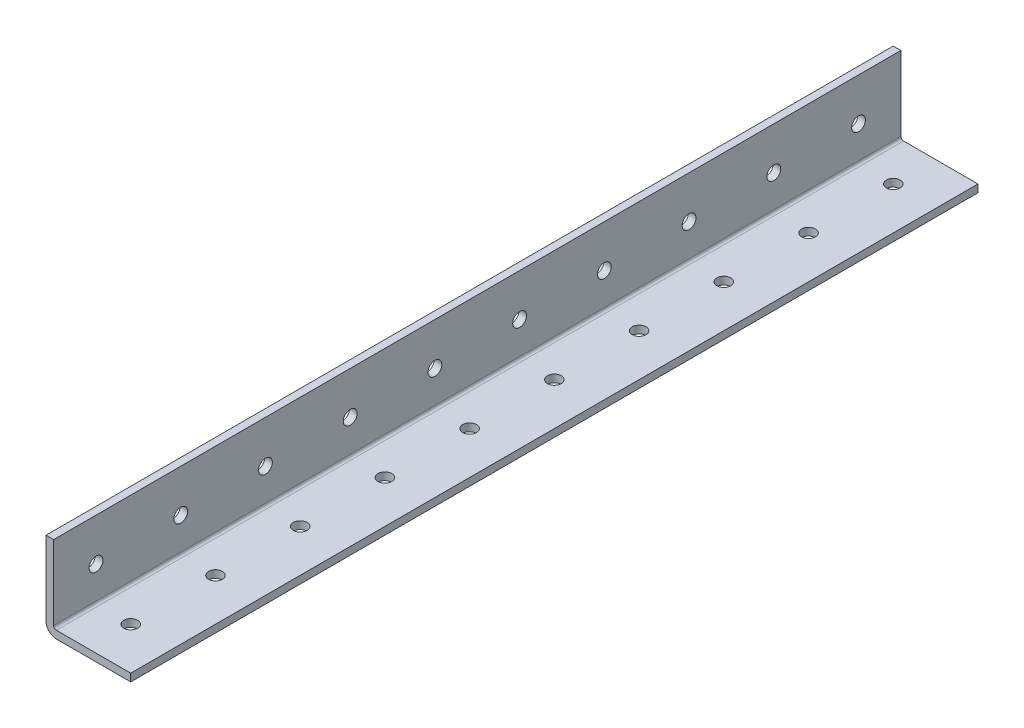
ISO-10303-21;
HEADER;
FILE_DESCRIPTION(('STEP AP214'),'2;1');
FILE_NAME('part.step','',(''),(''),'','','');
FILE_SCHEMA(('AUTOMOTIVE_DESIGN { 1 0 10303 214 1 1 1 1 }'));
ENDSEC;
DATA;
#1=APPLICATION_CONTEXT('core data for automotive mechanical design processes');
#2=APPLICATION_PROTOCOL_DEFINITION('international standard','automotive_design',2000,#1);
#3=PRODUCT_CONTEXT('',#1,'mechanical');
#4=PRODUCT('Part','Part','',(#3));
#5=PRODUCT_RELATED_PRODUCT_CATEGORY('part','',(#4));
#6=PRODUCT_DEFINITION_FORMATION('','',#4);
#7=PRODUCT_DEFINITION_CONTEXT('part definition',#1,'design');
#8=PRODUCT_DEFINITION('design','',#6,#7);
#9=PRODUCT_DEFINITION_SHAPE('','',#8);
#10=(LENGTH_UNIT() NAMED_UNIT(*) SI_UNIT(.MILLI.,.METRE.));
#11=(NAMED_UNIT(*) PLANE_ANGLE_UNIT() SI_UNIT($,.RADIAN.));
#12=(NAMED_UNIT(*) SI_UNIT($,.STERADIAN.) SOLID_ANGLE_UNIT());
#13=UNCERTAINTY_MEASURE_WITH_UNIT(LENGTH_MEASURE(1.E-05),#10,'distance_accuracy_value','');
#14=(GEOMETRIC_REPRESENTATION_CONTEXT(3) GLOBAL_UNCERTAINTY_ASSIGNED_CONTEXT((#13)) GLOBAL_UNIT_ASSIGNED_CONTEXT((#10,
#11,#12)) REPRESENTATION_CONTEXT('',''));
#15=CARTESIAN_POINT('',(0.,0.,0.));
#16=DIRECTION('',(0.,0.,1.));
#17=DIRECTION('',(1.,0.,0.));
#18=AXIS2_PLACEMENT_3D('',#15,#16,#17);
#19=CARTESIAN_POINT('',(3.0988,3.0988,-749.3));
#20=DIRECTION('',(0.,0.,1.));
#21=DIRECTION('',(1.,0.,0.));
#22=AXIS2_PLACEMENT_3D('',#19,#20,#21);
#23=CYLINDRICAL_SURFACE('',#22,0.8128);
#24=DIRECTION('',(0.,0.,-1.));
#25=VECTOR('',#24,1.);
#26=CARTESIAN_POINT('',(3.0988,2.286,-749.3));
#27=LINE('',#26,#25);
#28=CARTESIAN_POINT('',(3.0988,2.286,114.3));
#29=VERTEX_POINT('',#28);
#30=CARTESIAN_POINT('',(3.0988,2.286,-139.7));
#31=VERTEX_POINT('',#30);
#32=EDGE_CURVE('E93',#29,#31,#27,.T.);
#33=ORIENTED_EDGE('',*,*,#32,.T.);
#34=CARTESIAN_POINT('',(3.0988,3.0988,-139.7));
#35=DIRECTION('',(0.,0.,1.));
#36=DIRECTION('',(1.,0.,0.));
#37=AXIS2_PLACEMENT_3D('',#34,#35,#36);
#38=CIRCLE('',#37,0.8128);
#39=CARTESIAN_POINT('',(2.286,3.0988,-139.7));
#40=VERTEX_POINT('',#39);
#41=EDGE_CURVE('E20',#40,#31,#38,.T.);
#42=ORIENTED_EDGE('',*,*,#41,.F.);
#43=DIRECTION('',(0.,0.,1.));
#44=VECTOR('',#43,1.);
#45=CARTESIAN_POINT('',(2.286,3.0988,-749.3));
#46=LINE('',#45,#44);
#47=CARTESIAN_POINT('',(2.286,3.0988,114.3));
#48=VERTEX_POINT('',#47);
#49=EDGE_CURVE('E170',#40,#48,#46,.T.);
#50=ORIENTED_EDGE('',*,*,#49,.T.);
#51=CARTESIAN_POINT('',(3.0988,3.0988,114.3));
#52=DIRECTION('',(0.,0.,1.));
#53=DIRECTION('',(1.,0.,0.));
#54=AXIS2_PLACEMENT_3D('',#51,#52,#53);
#55=CIRCLE('',#54,0.8128);
#56=EDGE_CURVE('E91',#29,#48,#55,.F.);
#57=ORIENTED_EDGE('',*,*,#56,.F.);
#58=EDGE_LOOP('',(#33,#42,#50,#57));
#59=FACE_BOUND('',#58,.T.);
#60=ADVANCED_FACE('F17',(#59),#23,.F.);
#61=CARTESIAN_POINT('',(12.7,25.4000000000001,101.6));
#62=DIRECTION('',(0.,-1.,0.));
#63=DIRECTION('',(0.,0.,-1.));
#64=AXIS2_PLACEMENT_3D('',#61,#62,#63);
#65=CYLINDRICAL_SURFACE('',#64,2.07009999999999);
#66=CARTESIAN_POINT('',(12.7,2.286,101.6));
#67=DIRECTION('',(0.,-1.,0.));
#68=DIRECTION('',(0.,0.,-1.));
#69=AXIS2_PLACEMENT_3D('',#66,#67,#68);
#70=CIRCLE('',#69,2.07009999999999);
#71=CARTESIAN_POINT('',(12.7,2.286,99.5298999999999));
#72=VERTEX_POINT('',#71);
#73=EDGE_CURVE('E172',#72,#72,#70,.F.);
#74=ORIENTED_EDGE('',*,*,#73,.T.);
#75=EDGE_LOOP('',(#74));
#76=FACE_BOUND('',#75,.T.);
#77=CARTESIAN_POINT('',(12.7,0.,101.6));
#78=DIRECTION('',(0.,-1.,0.));
#79=DIRECTION('',(0.,0.,-1.));
#80=AXIS2_PLACEMENT_3D('',#77,#78,#79);
#81=CIRCLE('',#80,2.07009999999999);
#82=CARTESIAN_POINT('',(12.7,0.,99.5298999999999));
#83=VERTEX_POINT('',#82);
#84=EDGE_CURVE('E167',#83,#83,#81,.F.);
#85=ORIENTED_EDGE('',*,*,#84,.F.);
#86=EDGE_LOOP('',(#85));
#87=FACE_BOUND('',#86,.T.);
#88=ADVANCED_FACE('F427',(#76,#87),#65,.F.);
#89=CARTESIAN_POINT('',(12.7,25.4000000000001,76.1999999999999));
#90=DIRECTION('',(0.,-1.,0.));
#91=DIRECTION('',(0.,0.,-1.));
#92=AXIS2_PLACEMENT_3D('',#89,#90,#91);
#93=CYLINDRICAL_SURFACE('',#92,2.07009999999999);
#94=CARTESIAN_POINT('',(12.7,2.286,76.1999999999999));
#95=DIRECTION('',(0.,-1.,0.));
#96=DIRECTION('',(0.,0.,-1.));
#97=AXIS2_PLACEMENT_3D('',#94,#95,#96);
#98=CIRCLE('',#97,2.07009999999999);
#99=CARTESIAN_POINT('',(12.7,2.286,74.1298999999999));
#100=VERTEX_POINT('',#99);
#101=EDGE_CURVE('E292',#100,#100,#98,.F.);
#102=ORIENTED_EDGE('',*,*,#101,.T.);
#103=EDGE_LOOP('',(#102));
#104=FACE_BOUND('',#103,.T.);
#105=CARTESIAN_POINT('',(12.7,0.,76.1999999999999));
#106=DIRECTION('',(0.,-1.,0.));
#107=DIRECTION('',(0.,0.,-1.));
#108=AXIS2_PLACEMENT_3D('',#105,#106,#107);
#109=CIRCLE('',#108,2.07009999999999);
#110=CARTESIAN_POINT('',(12.7,0.,74.1298999999999));
#111=VERTEX_POINT('',#110);
#112=EDGE_CURVE('E264',#111,#111,#109,.F.);
#113=ORIENTED_EDGE('',*,*,#112,.F.);
#114=EDGE_LOOP('',(#113));
#115=FACE_BOUND('',#114,.T.);
#116=ADVANCED_FACE('F424',(#104,#115),#93,.F.);
#117=CARTESIAN_POINT('',(12.7,25.4000000000001,50.8));
#118=DIRECTION('',(0.,-1.,0.));
#119=DIRECTION('',(0.,0.,-1.));
#120=AXIS2_PLACEMENT_3D('',#117,#118,#119);
#121=CYLINDRICAL_SURFACE('',#120,2.07009999999999);
#122=CARTESIAN_POINT('',(12.7,2.286,50.8));
#123=DIRECTION('',(0.,-1.,0.));
#124=DIRECTION('',(0.,0.,-1.));
#125=AXIS2_PLACEMENT_3D('',#122,#123,#124);
#126=CIRCLE('',#125,2.07009999999999);
#127=CARTESIAN_POINT('',(12.7,2.286,48.7299));
#128=VERTEX_POINT('',#127);
#129=EDGE_CURVE('E289',#128,#128,#126,.F.);
#130=ORIENTED_EDGE('',*,*,#129,.T.);
#131=EDGE_LOOP('',(#130));
#132=FACE_BOUND('',#131,.T.);
#133=CARTESIAN_POINT('',(12.7,0.,50.8));
#134=DIRECTION('',(0.,-1.,0.));
#135=DIRECTION('',(0.,0.,-1.));
#136=AXIS2_PLACEMENT_3D('',#133,#134,#135);
#137=CIRCLE('',#136,2.07009999999999);
#138=CARTESIAN_POINT('',(12.7,0.,48.7299));
#139=VERTEX_POINT('',#138);
#140=EDGE_CURVE('E261',#139,#139,#137,.F.);
#141=ORIENTED_EDGE('',*,*,#140,.F.);
#142=EDGE_LOOP('',(#141));
#143=FACE_BOUND('',#142,.T.);
#144=ADVANCED_FACE('F420',(#132,#143),#121,.F.);
#145=CARTESIAN_POINT('',(12.7,25.4000000000001,25.4));
#146=DIRECTION('',(0.,-1.,0.));
#147=DIRECTION('',(0.,0.,-1.));
#148=AXIS2_PLACEMENT_3D('',#145,#146,#147);
#149=CYLINDRICAL_SURFACE('',#148,2.07009999999999);
#150=CARTESIAN_POINT('',(12.7,2.286,25.4));
#151=DIRECTION('',(0.,-1.,0.));
#152=DIRECTION('',(0.,0.,-1.));
#153=AXIS2_PLACEMENT_3D('',#150,#151,#152);
#154=CIRCLE('',#153,2.07009999999999);
#155=CARTESIAN_POINT('',(12.7,2.286,23.3299));
#156=VERTEX_POINT('',#155);
#157=EDGE_CURVE('E286',#156,#156,#154,.F.);
#158=ORIENTED_EDGE('',*,*,#157,.T.);
#159=EDGE_LOOP('',(#158));
#160=FACE_BOUND('',#159,.T.);
#161=CARTESIAN_POINT('',(12.7,0.,25.4));
#162=DIRECTION('',(0.,-1.,0.));
#163=DIRECTION('',(0.,0.,-1.));
#164=AXIS2_PLACEMENT_3D('',#161,#162,#163);
#165=CIRCLE('',#164,2.07009999999999);
#166=CARTESIAN_POINT('',(12.7,0.,23.3299));
#167=VERTEX_POINT('',#166);
#168=EDGE_CURVE('E258',#167,#167,#165,.F.);
#169=ORIENTED_EDGE('',*,*,#168,.F.);
#170=EDGE_LOOP('',(#169));
#171=FACE_BOUND('',#170,.T.);
#172=ADVANCED_FACE('F416',(#160,#171),#149,.F.);
#173=CARTESIAN_POINT('',(12.7,25.4000000000001,0.));
#174=DIRECTION('',(0.,-1.,0.));
#175=DIRECTION('',(0.,0.,-1.));
#176=AXIS2_PLACEMENT_3D('',#173,#174,#175);
#177=CYLINDRICAL_SURFACE('',#176,2.07009999999999);
#178=CARTESIAN_POINT('',(12.7,2.286,0.));
#179=DIRECTION('',(0.,-1.,0.));
#180=DIRECTION('',(0.,0.,-1.));
#181=AXIS2_PLACEMENT_3D('',#178,#179,#180);
#182=CIRCLE('',#181,2.07009999999999);
#183=CARTESIAN_POINT('',(12.7,2.286,-2.07009999999999));
#184=VERTEX_POINT('',#183);
#185=EDGE_CURVE('E283',#184,#184,#182,.F.);
#186=ORIENTED_EDGE('',*,*,#185,.T.);
#187=EDGE_LOOP('',(#186));
#188=FACE_BOUND('',#187,.T.);
#189=CARTESIAN_POINT('',(12.7,0.,0.));
#190=DIRECTION('',(0.,-1.,0.));
#191=DIRECTION('',(0.,0.,-1.));
#192=AXIS2_PLACEMENT_3D('',#189,#190,#191);
#193=CIRCLE('',#192,2.07009999999999);
#194=CARTESIAN_POINT('',(12.7,0.,-2.07009999999999));
#195=VERTEX_POINT('',#194);
#196=EDGE_CURVE('E255',#195,#195,#193,.F.);
#197=ORIENTED_EDGE('',*,*,#196,.F.);
#198=EDGE_LOOP('',(#197));
#199=FACE_BOUND('',#198,.T.);
#200=ADVANCED_FACE('F412',(#188,#199),#177,.F.);
#201=CARTESIAN_POINT('',(12.7,25.4000000000001,-25.4000000000001));
#202=DIRECTION('',(0.,-1.,0.));
#203=DIRECTION('',(0.,0.,-1.));
#204=AXIS2_PLACEMENT_3D('',#201,#202,#203);
#205=CYLINDRICAL_SURFACE('',#204,2.07009999999999);
#206=CARTESIAN_POINT('',(12.7,2.286,-25.4000000000001));
#207=DIRECTION('',(0.,-1.,0.));
#208=DIRECTION('',(0.,0.,-1.));
#209=AXIS2_PLACEMENT_3D('',#206,#207,#208);
#210=CIRCLE('',#209,2.07009999999999);
#211=CARTESIAN_POINT('',(12.7,2.286,-27.4701000000001));
#212=VERTEX_POINT('',#211);
#213=EDGE_CURVE('E280',#212,#212,#210,.F.);
#214=ORIENTED_EDGE('',*,*,#213,.T.);
#215=EDGE_LOOP('',(#214));
#216=FACE_BOUND('',#215,.T.);
#217=CARTESIAN_POINT('',(12.7,0.,-25.4000000000001));
#218=DIRECTION('',(0.,-1.,0.));
#219=DIRECTION('',(0.,0.,-1.));
#220=AXIS2_PLACEMENT_3D('',#217,#218,#219);
#221=CIRCLE('',#220,2.07009999999999);
#222=CARTESIAN_POINT('',(12.7,0.,-27.4701000000001));
#223=VERTEX_POINT('',#222);
#224=EDGE_CURVE('E252',#223,#223,#221,.F.);
#225=ORIENTED_EDGE('',*,*,#224,.F.);
#226=EDGE_LOOP('',(#225));
#227=FACE_BOUND('',#226,.T.);
#228=ADVANCED_FACE('F408',(#216,#227),#205,.F.);
#229=CARTESIAN_POINT('',(12.7,25.4000000000001,-50.8000000000001));
#230=DIRECTION('',(0.,-1.,0.));
#231=DIRECTION('',(0.,0.,-1.));
#232=AXIS2_PLACEMENT_3D('',#229,#230,#231);
#233=CYLINDRICAL_SURFACE('',#232,2.07009999999999);
#234=CARTESIAN_POINT('',(12.7,2.286,-50.8000000000001));
#235=DIRECTION('',(0.,-1.,0.));
#236=DIRECTION('',(0.,0.,-1.));
#237=AXIS2_PLACEMENT_3D('',#234,#235,#236);
#238=CIRCLE('',#237,2.07009999999999);
#239=CARTESIAN_POINT('',(12.7,2.286,-52.8701000000001));
#240=VERTEX_POINT('',#239);
#241=EDGE_CURVE('E277',#240,#240,#238,.F.);
#242=ORIENTED_EDGE('',*,*,#241,.T.);
#243=EDGE_LOOP('',(#242));
#244=FACE_BOUND('',#243,.T.);
#245=CARTESIAN_POINT('',(12.7,0.,-50.8000000000001));
#246=DIRECTION('',(0.,-1.,0.));
#247=DIRECTION('',(0.,0.,-1.));
#248=AXIS2_PLACEMENT_3D('',#245,#246,#247);
#249=CIRCLE('',#248,2.07009999999999);
#250=CARTESIAN_POINT('',(12.7,0.,-52.8701000000001));
#251=VERTEX_POINT('',#250);
#252=EDGE_CURVE('E249',#251,#251,#249,.F.);
#253=ORIENTED_EDGE('',*,*,#252,.F.);
#254=EDGE_LOOP('',(#253));
#255=FACE_BOUND('',#254,.T.);
#256=ADVANCED_FACE('F404',(#244,#255),#233,.F.);
#257=CARTESIAN_POINT('',(12.7,25.4000000000001,-76.2));
#258=DIRECTION('',(0.,-1.,0.));
#259=DIRECTION('',(0.,0.,-1.));
#260=AXIS2_PLACEMENT_3D('',#257,#258,#259);
#261=CYLINDRICAL_SURFACE('',#260,2.07009999999999);
#262=CARTESIAN_POINT('',(12.7,2.286,-76.2));
#263=DIRECTION('',(0.,-1.,0.));
#264=DIRECTION('',(0.,0.,-1.));
#265=AXIS2_PLACEMENT_3D('',#262,#263,#264);
#266=CIRCLE('',#265,2.07009999999999);
#267=CARTESIAN_POINT('',(12.7,2.286,-78.2701));
#268=VERTEX_POINT('',#267);
#269=EDGE_CURVE('E274',#268,#268,#266,.F.);
#270=ORIENTED_EDGE('',*,*,#269,.T.);
#271=EDGE_LOOP('',(#270));
#272=FACE_BOUND('',#271,.T.);
#273=CARTESIAN_POINT('',(12.7,0.,-76.2));
#274=DIRECTION('',(0.,-1.,0.));
#275=DIRECTION('',(0.,0.,-1.));
#276=AXIS2_PLACEMENT_3D('',#273,#274,#275);
#277=CIRCLE('',#276,2.07009999999999);
#278=CARTESIAN_POINT('',(12.7,0.,-78.2701));
#279=VERTEX_POINT('',#278);
#280=EDGE_CURVE('E246',#279,#279,#277,.F.);
#281=ORIENTED_EDGE('',*,*,#280,.F.);
#282=EDGE_LOOP('',(#281));
#283=FACE_BOUND('',#282,.T.);
#284=ADVANCED_FACE('F400',(#272,#283),#261,.F.);
#285=CARTESIAN_POINT('',(12.7,25.4000000000001,-101.6));
#286=DIRECTION('',(0.,-1.,0.));
#287=DIRECTION('',(0.,0.,-1.));
#288=AXIS2_PLACEMENT_3D('',#285,#286,#287);
#289=CYLINDRICAL_SURFACE('',#288,2.07009999999999);
#290=CARTESIAN_POINT('',(12.7,2.286,-101.6));
#291=DIRECTION('',(0.,-1.,0.));
#292=DIRECTION('',(0.,0.,-1.));
#293=AXIS2_PLACEMENT_3D('',#290,#291,#292);
#294=CIRCLE('',#293,2.07009999999999);
#295=CARTESIAN_POINT('',(12.7,2.286,-103.6701));
#296=VERTEX_POINT('',#295);
#297=EDGE_CURVE('E271',#296,#296,#294,.F.);
#298=ORIENTED_EDGE('',*,*,#297,.T.);
#299=EDGE_LOOP('',(#298));
#300=FACE_BOUND('',#299,.T.);
#301=CARTESIAN_POINT('',(12.7,0.,-101.6));
#302=DIRECTION('',(0.,-1.,0.));
#303=DIRECTION('',(0.,0.,-1.));
#304=AXIS2_PLACEMENT_3D('',#301,#302,#303);
#305=CIRCLE('',#304,2.07009999999999);
#306=CARTESIAN_POINT('',(12.7,0.,-103.6701));
#307=VERTEX_POINT('',#306);
#308=EDGE_CURVE('E243',#307,#307,#305,.F.);
#309=ORIENTED_EDGE('',*,*,#308,.F.);
#310=EDGE_LOOP('',(#309));
#311=FACE_BOUND('',#310,.T.);
#312=ADVANCED_FACE('F394',(#300,#311),#289,.F.);
#313=CARTESIAN_POINT('',(12.7,25.4000000000001,-127.));
#314=DIRECTION('',(0.,-1.,0.));
#315=DIRECTION('',(0.,0.,-1.));
#316=AXIS2_PLACEMENT_3D('',#313,#314,#315);
#317=CYLINDRICAL_SURFACE('',#316,2.07009999999999);
#318=CARTESIAN_POINT('',(12.7,2.286,-127.));
#319=DIRECTION('',(0.,-1.,0.));
#320=DIRECTION('',(0.,0.,-1.));
#321=AXIS2_PLACEMENT_3D('',#318,#319,#320);
#322=CIRCLE('',#321,2.07009999999999);
#323=CARTESIAN_POINT('',(12.7,2.286,-129.0701));
#324=VERTEX_POINT('',#323);
#325=EDGE_CURVE('E98',#324,#324,#322,.F.);
#326=ORIENTED_EDGE('',*,*,#325,.T.);
#327=EDGE_LOOP('',(#326));
#328=FACE_BOUND('',#327,.T.);
#329=CARTESIAN_POINT('',(12.7,0.,-127.));
#330=DIRECTION('',(0.,-1.,0.));
#331=DIRECTION('',(0.,0.,-1.));
#332=AXIS2_PLACEMENT_3D('',#329,#330,#331);
#333=CIRCLE('',#332,2.07009999999999);
#334=CARTESIAN_POINT('',(12.7,0.,-129.0701));
#335=VERTEX_POINT('',#334);
#336=EDGE_CURVE('E161',#335,#335,#333,.F.);
#337=ORIENTED_EDGE('',*,*,#336,.F.);
#338=EDGE_LOOP('',(#337));
#339=FACE_BOUND('',#338,.T.);
#340=ADVANCED_FACE('F389',(#328,#339),#317,.F.);
#341=CARTESIAN_POINT('',(2.286,0.,-749.3));
#342=DIRECTION('',(-1.,0.,0.));
#343=DIRECTION('',(0.,0.,1.));
#344=AXIS2_PLACEMENT_3D('',#341,#342,#343);
#345=PLANE('',#344);
#346=ORIENTED_EDGE('',*,*,#49,.F.);
#347=DIRECTION('',(0.,1.,0.));
#348=VECTOR('',#347,1.);
#349=CARTESIAN_POINT('',(2.286,0.,-139.7));
#350=LINE('',#349,#348);
#351=CARTESIAN_POINT('',(2.286,25.4,-139.7));
#352=VERTEX_POINT('',#351);
#353=EDGE_CURVE('E90',#352,#40,#350,.F.);
#354=ORIENTED_EDGE('',*,*,#353,.F.);
#355=DIRECTION('',(0.,0.,-1.));
#356=VECTOR('',#355,1.);
#357=CARTESIAN_POINT('',(2.286,25.4,-749.3));
#358=LINE('',#357,#356);
#359=CARTESIAN_POINT('',(2.286,25.4,114.3));
#360=VERTEX_POINT('',#359);
#361=EDGE_CURVE('E132',#352,#360,#358,.F.);
#362=ORIENTED_EDGE('',*,*,#361,.T.);
#363=DIRECTION('',(0.,1.,0.));
#364=VECTOR('',#363,1.);
#365=CARTESIAN_POINT('',(2.286,0.,114.3));
#366=LINE('',#365,#364);
#367=EDGE_CURVE('E139',#48,#360,#366,.T.);
#368=ORIENTED_EDGE('',*,*,#367,.F.);
#369=EDGE_LOOP('',(#346,#354,#362,#368));
#370=FACE_BOUND('',#369,.T.);
#371=CARTESIAN_POINT('',(2.286,12.7,101.6));
#372=DIRECTION('',(-1.,0.,0.));
#373=DIRECTION('',(0.,0.,1.));
#374=AXIS2_PLACEMENT_3D('',#371,#372,#373);
#375=CIRCLE('',#374,2.07009999999992);
#376=CARTESIAN_POINT('',(2.286,12.7,103.6701));
#377=VERTEX_POINT('',#376);
#378=EDGE_CURVE('E157',#377,#377,#375,.T.);
#379=ORIENTED_EDGE('',*,*,#378,.T.);
#380=EDGE_LOOP('',(#379));
#381=FACE_BOUND('',#380,.T.);
#382=CARTESIAN_POINT('',(2.286,12.7,76.1999999999999));
#383=DIRECTION('',(-1.,0.,0.));
#384=DIRECTION('',(0.,0.,1.));
#385=AXIS2_PLACEMENT_3D('',#382,#383,#384);
#386=CIRCLE('',#385,2.07009999999992);
#387=CARTESIAN_POINT('',(2.286,12.7,78.2700999999999));
#388=VERTEX_POINT('',#387);
#389=EDGE_CURVE('E215',#388,#388,#386,.T.);
#390=ORIENTED_EDGE('',*,*,#389,.T.);
#391=EDGE_LOOP('',(#390));
#392=FACE_BOUND('',#391,.T.);
#393=CARTESIAN_POINT('',(2.286,12.7,50.8));
#394=DIRECTION('',(-1.,0.,0.));
#395=DIRECTION('',(0.,0.,1.));
#396=AXIS2_PLACEMENT_3D('',#393,#394,#395);
#397=CIRCLE('',#396,2.07009999999993);
#398=CARTESIAN_POINT('',(2.286,12.7,52.8700999999999));
#399=VERTEX_POINT('',#398);
#400=EDGE_CURVE('E218',#399,#399,#397,.T.);
#401=ORIENTED_EDGE('',*,*,#400,.T.);
#402=EDGE_LOOP('',(#401));
#403=FACE_BOUND('',#402,.T.);
#404=CARTESIAN_POINT('',(2.286,12.7,25.4));
#405=DIRECTION('',(-1.,0.,0.));
#406=DIRECTION('',(0.,0.,1.));
#407=AXIS2_PLACEMENT_3D('',#404,#405,#406);
#408=CIRCLE('',#407,2.07009999999993);
#409=CARTESIAN_POINT('',(2.286,12.7,27.4700999999999));
#410=VERTEX_POINT('',#409);
#411=EDGE_CURVE('E221',#410,#410,#408,.T.);
#412=ORIENTED_EDGE('',*,*,#411,.T.);
#413=EDGE_LOOP('',(#412));
#414=FACE_BOUND('',#413,.T.);
#415=CARTESIAN_POINT('',(2.286,12.7,0.));
#416=DIRECTION('',(-1.,0.,0.));
#417=DIRECTION('',(0.,0.,1.));
#418=AXIS2_PLACEMENT_3D('',#415,#416,#417);
#419=CIRCLE('',#418,2.07009999999993);
#420=CARTESIAN_POINT('',(2.286,12.7,2.07009999999993));
#421=VERTEX_POINT('',#420);
#422=EDGE_CURVE('E224',#421,#421,#419,.T.);
#423=ORIENTED_EDGE('',*,*,#422,.T.);
#424=EDGE_LOOP('',(#423));
#425=FACE_BOUND('',#424,.T.);
#426=CARTESIAN_POINT('',(2.286,12.7,-25.4000000000001));
#427=DIRECTION('',(-1.,0.,0.));
#428=DIRECTION('',(0.,0.,1.));
#429=AXIS2_PLACEMENT_3D('',#426,#427,#428);
#430=CIRCLE('',#429,2.07009999999993);
#431=CARTESIAN_POINT('',(2.286,12.7,-23.3299000000002));
#432=VERTEX_POINT('',#431);
#433=EDGE_CURVE('E227',#432,#432,#430,.T.);
#434=ORIENTED_EDGE('',*,*,#433,.T.);
#435=EDGE_LOOP('',(#434));
#436=FACE_BOUND('',#435,.T.);
#437=CARTESIAN_POINT('',(2.286,12.7,-50.8000000000001));
#438=DIRECTION('',(-1.,0.,0.));
#439=DIRECTION('',(0.,0.,1.));
#440=AXIS2_PLACEMENT_3D('',#437,#438,#439);
#441=CIRCLE('',#440,2.07009999999993);
#442=CARTESIAN_POINT('',(2.286,12.7,-48.7299000000001));
#443=VERTEX_POINT('',#442);
#444=EDGE_CURVE('E230',#443,#443,#441,.T.);
#445=ORIENTED_EDGE('',*,*,#444,.T.);
#446=EDGE_LOOP('',(#445));
#447=FACE_BOUND('',#446,.T.);
#448=CARTESIAN_POINT('',(2.286,12.7,-76.2));
#449=DIRECTION('',(-1.,0.,0.));
#450=DIRECTION('',(0.,0.,1.));
#451=AXIS2_PLACEMENT_3D('',#448,#449,#450);
#452=CIRCLE('',#451,2.07009999999992);
#453=CARTESIAN_POINT('',(2.286,12.7,-74.1299000000001));
#454=VERTEX_POINT('',#453);
#455=EDGE_CURVE('E233',#454,#454,#452,.T.);
#456=ORIENTED_EDGE('',*,*,#455,.T.);
#457=EDGE_LOOP('',(#456));
#458=FACE_BOUND('',#457,.T.);
#459=CARTESIAN_POINT('',(2.286,12.7,-101.6));
#460=DIRECTION('',(-1.,0.,0.));
#461=DIRECTION('',(0.,0.,1.));
#462=AXIS2_PLACEMENT_3D('',#459,#460,#461);
#463=CIRCLE('',#462,2.07009999999992);
#464=CARTESIAN_POINT('',(2.286,12.7,-99.5299000000001));
#465=VERTEX_POINT('',#464);
#466=EDGE_CURVE('E236',#465,#465,#463,.T.);
#467=ORIENTED_EDGE('',*,*,#466,.T.);
#468=EDGE_LOOP('',(#467));
#469=FACE_BOUND('',#468,.T.);
#470=CARTESIAN_POINT('',(2.286,12.7,-127.));
#471=DIRECTION('',(-1.,0.,0.));
#472=DIRECTION('',(0.,0.,1.));
#473=AXIS2_PLACEMENT_3D('',#470,#471,#472);
#474=CIRCLE('',#473,2.07009999999992);
#475=CARTESIAN_POINT('',(2.286,12.7,-124.9299));
#476=VERTEX_POINT('',#475);
#477=EDGE_CURVE('E160',#476,#476,#474,.T.);
#478=ORIENTED_EDGE('',*,*,#477,.T.);
#479=EDGE_LOOP('',(#478));
#480=FACE_BOUND('',#479,.T.);
#481=ADVANCED_FACE('F301',(#370,#381,#392,#403,#414,#425,#436,#447,#458,#469,#480),#345,.F.);
#482=CARTESIAN_POINT('',(0.,2.286,-749.3));
#483=DIRECTION('',(0.,-1.,0.));
#484=DIRECTION('',(0.,0.,-1.));
#485=AXIS2_PLACEMENT_3D('',#482,#483,#484);
#486=PLANE('',#485);
#487=DIRECTION('',(0.,0.,1.));
#488=VECTOR('',#487,1.);
#489=CARTESIAN_POINT('',(25.4,2.286,-749.3));
#490=LINE('',#489,#488);
#491=CARTESIAN_POINT('',(25.4,2.286,114.3));
#492=VERTEX_POINT('',#491);
#493=CARTESIAN_POINT('',(25.4,2.286,-139.7));
#494=VERTEX_POINT('',#493);
#495=EDGE_CURVE('E97',#492,#494,#490,.F.);
#496=ORIENTED_EDGE('',*,*,#495,.T.);
#497=DIRECTION('',(-1.,0.,0.));
#498=VECTOR('',#497,1.);
#499=CARTESIAN_POINT('',(-1.48594147035509,2.286,-139.7));
#500=LINE('',#499,#498);
#501=EDGE_CURVE('E88',#31,#494,#500,.F.);
#502=ORIENTED_EDGE('',*,*,#501,.F.);
#503=ORIENTED_EDGE('',*,*,#32,.F.);
#504=DIRECTION('',(1.,0.,0.));
#505=VECTOR('',#504,1.);
#506=CARTESIAN_POINT('',(-1.48594147035509,2.286,114.3));
#507=LINE('',#506,#505);
#508=EDGE_CURVE('E142',#492,#29,#507,.F.);
#509=ORIENTED_EDGE('',*,*,#508,.F.);
#510=EDGE_LOOP('',(#496,#502,#503,#509));
#511=FACE_BOUND('',#510,.T.);
#512=ORIENTED_EDGE('',*,*,#325,.F.);
#513=EDGE_LOOP('',(#512));
#514=FACE_BOUND('',#513,.T.);
#515=ORIENTED_EDGE('',*,*,#297,.F.);
#516=EDGE_LOOP('',(#515));
#517=FACE_BOUND('',#516,.T.);
#518=ORIENTED_EDGE('',*,*,#269,.F.);
#519=EDGE_LOOP('',(#518));
#520=FACE_BOUND('',#519,.T.);
#521=ORIENTED_EDGE('',*,*,#241,.F.);
#522=EDGE_LOOP('',(#521));
#523=FACE_BOUND('',#522,.T.);
#524=ORIENTED_EDGE('',*,*,#213,.F.);
#525=EDGE_LOOP('',(#524));
#526=FACE_BOUND('',#525,.T.);
#527=ORIENTED_EDGE('',*,*,#185,.F.);
#528=EDGE_LOOP('',(#527));
#529=FACE_BOUND('',#528,.T.);
#530=ORIENTED_EDGE('',*,*,#157,.F.);
#531=EDGE_LOOP('',(#530));
#532=FACE_BOUND('',#531,.T.);
#533=ORIENTED_EDGE('',*,*,#129,.F.);
#534=EDGE_LOOP('',(#533));
#535=FACE_BOUND('',#534,.T.);
#536=ORIENTED_EDGE('',*,*,#101,.F.);
#537=EDGE_LOOP('',(#536));
#538=FACE_BOUND('',#537,.T.);
#539=ORIENTED_EDGE('',*,*,#73,.F.);
#540=EDGE_LOOP('',(#539));
#541=FACE_BOUND('',#540,.T.);
#542=ADVANCED_FACE('F100',(#511,#514,#517,#520,#523,#526,#529,#532,#535,#538,#541),#486,.F.);
#543=CARTESIAN_POINT('',(25.4,2.286,-749.3));
#544=DIRECTION('',(-1.,0.,0.));
#545=DIRECTION('',(0.,0.,1.));
#546=AXIS2_PLACEMENT_3D('',#543,#544,#545);
#547=PLANE('',#546);
#548=DIRECTION('',(0.,0.,-1.));
#549=VECTOR('',#548,1.);
#550=CARTESIAN_POINT('',(25.4,0.,-749.3));
#551=LINE('',#550,#549);
#552=CARTESIAN_POINT('',(25.4,0.,-139.7));
#553=VERTEX_POINT('',#552);
#554=CARTESIAN_POINT('',(25.4,0.,114.3));
#555=VERTEX_POINT('',#554);
#556=EDGE_CURVE('E158',#553,#555,#551,.F.);
#557=ORIENTED_EDGE('',*,*,#556,.F.);
#558=DIRECTION('',(0.,1.,0.));
#559=VECTOR('',#558,1.);
#560=CARTESIAN_POINT('',(25.4,0.,-139.7));
#561=LINE('',#560,#559);
#562=EDGE_CURVE('E103',#494,#553,#561,.F.);
#563=ORIENTED_EDGE('',*,*,#562,.F.);
#564=ORIENTED_EDGE('',*,*,#495,.F.);
#565=DIRECTION('',(0.,1.,0.));
#566=VECTOR('',#565,1.);
#567=CARTESIAN_POINT('',(25.4,0.,114.3));
#568=LINE('',#567,#566);
#569=EDGE_CURVE('E146',#555,#492,#568,.T.);
#570=ORIENTED_EDGE('',*,*,#569,.F.);
#571=EDGE_LOOP('',(#557,#563,#564,#570));
#572=FACE_BOUND('',#571,.T.);
#573=ADVANCED_FACE('F319',(#572),#547,.F.);
#574=CARTESIAN_POINT('',(0.,0.,-749.3));
#575=DIRECTION('',(0.,-1.,0.));
#576=DIRECTION('',(0.,0.,-1.));
#577=AXIS2_PLACEMENT_3D('',#574,#575,#576);
#578=PLANE('',#577);
#579=DIRECTION('',(0.,0.,1.));
#580=VECTOR('',#579,1.);
#581=CARTESIAN_POINT('',(3.0988,0.,-749.3));
#582=LINE('',#581,#580);
#583=CARTESIAN_POINT('',(3.0988,0.,-139.7));
#584=VERTEX_POINT('',#583);
#585=CARTESIAN_POINT('',(3.0988,0.,114.3));
#586=VERTEX_POINT('',#585);
#587=EDGE_CURVE('E155',#584,#586,#582,.T.);
#588=ORIENTED_EDGE('',*,*,#587,.F.);
#589=DIRECTION('',(-1.,0.,0.));
#590=VECTOR('',#589,1.);
#591=CARTESIAN_POINT('',(-1.48594147035509,0.,-139.7));
#592=LINE('',#591,#590);
#593=EDGE_CURVE('E105',#553,#584,#592,.T.);
#594=ORIENTED_EDGE('',*,*,#593,.F.);
#595=ORIENTED_EDGE('',*,*,#556,.T.);
#596=DIRECTION('',(1.,0.,0.));
#597=VECTOR('',#596,1.);
#598=CARTESIAN_POINT('',(-1.48594147035509,0.,114.3));
#599=LINE('',#598,#597);
#600=EDGE_CURVE('E149',#586,#555,#599,.T.);
#601=ORIENTED_EDGE('',*,*,#600,.F.);
#602=EDGE_LOOP('',(#588,#594,#595,#601));
#603=FACE_BOUND('',#602,.T.);
#604=ORIENTED_EDGE('',*,*,#336,.T.);
#605=EDGE_LOOP('',(#604));
#606=FACE_BOUND('',#605,.T.);
#607=ORIENTED_EDGE('',*,*,#308,.T.);
#608=EDGE_LOOP('',(#607));
#609=FACE_BOUND('',#608,.T.);
#610=ORIENTED_EDGE('',*,*,#280,.T.);
#611=EDGE_LOOP('',(#610));
#612=FACE_BOUND('',#611,.T.);
#613=ORIENTED_EDGE('',*,*,#252,.T.);
#614=EDGE_LOOP('',(#613));
#615=FACE_BOUND('',#614,.T.);
#616=ORIENTED_EDGE('',*,*,#224,.T.);
#617=EDGE_LOOP('',(#616));
#618=FACE_BOUND('',#617,.T.);
#619=ORIENTED_EDGE('',*,*,#196,.T.);
#620=EDGE_LOOP('',(#619));
#621=FACE_BOUND('',#620,.T.);
#622=ORIENTED_EDGE('',*,*,#168,.T.);
#623=EDGE_LOOP('',(#622));
#624=FACE_BOUND('',#623,.T.);
#625=ORIENTED_EDGE('',*,*,#140,.T.);
#626=EDGE_LOOP('',(#625));
#627=FACE_BOUND('',#626,.T.);
#628=ORIENTED_EDGE('',*,*,#112,.T.);
#629=EDGE_LOOP('',(#628));
#630=FACE_BOUND('',#629,.T.);
#631=ORIENTED_EDGE('',*,*,#84,.T.);
#632=EDGE_LOOP('',(#631));
#633=FACE_BOUND('',#632,.T.);
#634=ADVANCED_FACE('F314',(#603,#606,#609,#612,#615,#618,#621,#624,#627,#630,#633),#578,.T.);
#635=CARTESIAN_POINT('',(25.4,12.7,-127.));
#636=DIRECTION('',(-1.,0.,0.));
#637=DIRECTION('',(0.,0.,1.));
#638=AXIS2_PLACEMENT_3D('',#635,#636,#637);
#639=CYLINDRICAL_SURFACE('',#638,2.07009999999992);
#640=ORIENTED_EDGE('',*,*,#477,.F.);
#641=EDGE_LOOP('',(#640));
#642=FACE_BOUND('',#641,.T.);
#643=CARTESIAN_POINT('',(0.,12.7,-127.));
#644=DIRECTION('',(-1.,0.,0.));
#645=DIRECTION('',(0.,0.,1.));
#646=AXIS2_PLACEMENT_3D('',#643,#644,#645);
#647=CIRCLE('',#646,2.07009999999992);
#648=CARTESIAN_POINT('',(0.,12.7,-124.9299));
#649=VERTEX_POINT('',#648);
#650=EDGE_CURVE('E206',#649,#649,#647,.F.);
#651=ORIENTED_EDGE('',*,*,#650,.F.);
#652=EDGE_LOOP('',(#651));
#653=FACE_BOUND('',#652,.T.);
#654=ADVANCED_FACE('F327',(#642,#653),#639,.F.);
#655=CARTESIAN_POINT('',(25.4,12.7,-101.6));
#656=DIRECTION('',(-1.,0.,0.));
#657=DIRECTION('',(0.,0.,1.));
#658=AXIS2_PLACEMENT_3D('',#655,#656,#657);
#659=CYLINDRICAL_SURFACE('',#658,2.07009999999992);
#660=ORIENTED_EDGE('',*,*,#466,.F.);
#661=EDGE_LOOP('',(#660));
#662=FACE_BOUND('',#661,.T.);
#663=CARTESIAN_POINT('',(0.,12.7,-101.6));
#664=DIRECTION('',(-1.,0.,0.));
#665=DIRECTION('',(0.,0.,1.));
#666=AXIS2_PLACEMENT_3D('',#663,#664,#665);
#667=CIRCLE('',#666,2.07009999999992);
#668=CARTESIAN_POINT('',(0.,12.7,-99.5299000000001));
#669=VERTEX_POINT('',#668);
#670=EDGE_CURVE('E203',#669,#669,#667,.F.);
#671=ORIENTED_EDGE('',*,*,#670,.F.);
#672=EDGE_LOOP('',(#671));
#673=FACE_BOUND('',#672,.T.);
#674=ADVANCED_FACE('F374',(#662,#673),#659,.F.);
#675=CARTESIAN_POINT('',(25.4,12.7,-76.2));
#676=DIRECTION('',(-1.,0.,0.));
#677=DIRECTION('',(0.,0.,1.));
#678=AXIS2_PLACEMENT_3D('',#675,#676,#677);
#679=CYLINDRICAL_SURFACE('',#678,2.07009999999992);
#680=ORIENTED_EDGE('',*,*,#455,.F.);
#681=EDGE_LOOP('',(#680));
#682=FACE_BOUND('',#681,.T.);
#683=CARTESIAN_POINT('',(0.,12.7,-76.2));
#684=DIRECTION('',(-1.,0.,0.));
#685=DIRECTION('',(0.,0.,1.));
#686=AXIS2_PLACEMENT_3D('',#683,#684,#685);
#687=CIRCLE('',#686,2.07009999999992);
#688=CARTESIAN_POINT('',(0.,12.7,-74.1299000000001));
#689=VERTEX_POINT('',#688);
#690=EDGE_CURVE('E200',#689,#689,#687,.F.);
#691=ORIENTED_EDGE('',*,*,#690,.F.);
#692=EDGE_LOOP('',(#691));
#693=FACE_BOUND('',#692,.T.);
#694=ADVANCED_FACE('F370',(#682,#693),#679,.F.);
#695=CARTESIAN_POINT('',(25.4,12.7,-50.8000000000001));
#696=DIRECTION('',(-1.,0.,0.));
#697=DIRECTION('',(0.,0.,1.));
#698=AXIS2_PLACEMENT_3D('',#695,#696,#697);
#699=CYLINDRICAL_SURFACE('',#698,2.07009999999993);
#700=ORIENTED_EDGE('',*,*,#444,.F.);
#701=EDGE_LOOP('',(#700));
#702=FACE_BOUND('',#701,.T.);
#703=CARTESIAN_POINT('',(0.,12.7,-50.8000000000001));
#704=DIRECTION('',(-1.,0.,0.));
#705=DIRECTION('',(0.,0.,1.));
#706=AXIS2_PLACEMENT_3D('',#703,#704,#705);
#707=CIRCLE('',#706,2.07009999999993);
#708=CARTESIAN_POINT('',(0.,12.7,-48.7299000000001));
#709=VERTEX_POINT('',#708);
#710=EDGE_CURVE('E197',#709,#709,#707,.F.);
#711=ORIENTED_EDGE('',*,*,#710,.F.);
#712=EDGE_LOOP('',(#711));
#713=FACE_BOUND('',#712,.T.);
#714=ADVANCED_FACE('F366',(#702,#713),#699,.F.);
#715=CARTESIAN_POINT('',(25.4,12.7,-25.4000000000001));
#716=DIRECTION('',(-1.,0.,0.));
#717=DIRECTION('',(0.,0.,1.));
#718=AXIS2_PLACEMENT_3D('',#715,#716,#717);
#719=CYLINDRICAL_SURFACE('',#718,2.07009999999993);
#720=ORIENTED_EDGE('',*,*,#433,.F.);
#721=EDGE_LOOP('',(#720));
#722=FACE_BOUND('',#721,.T.);
#723=CARTESIAN_POINT('',(0.,12.7,-25.4000000000001));
#724=DIRECTION('',(-1.,0.,0.));
#725=DIRECTION('',(0.,0.,1.));
#726=AXIS2_PLACEMENT_3D('',#723,#724,#725);
#727=CIRCLE('',#726,2.07009999999993);
#728=CARTESIAN_POINT('',(0.,12.7,-23.3299000000002));
#729=VERTEX_POINT('',#728);
#730=EDGE_CURVE('E194',#729,#729,#727,.F.);
#731=ORIENTED_EDGE('',*,*,#730,.F.);
#732=EDGE_LOOP('',(#731));
#733=FACE_BOUND('',#732,.T.);
#734=ADVANCED_FACE('F362',(#722,#733),#719,.F.);
#735=CARTESIAN_POINT('',(25.4,12.7,0.));
#736=DIRECTION('',(-1.,0.,0.));
#737=DIRECTION('',(0.,0.,1.));
#738=AXIS2_PLACEMENT_3D('',#735,#736,#737);
#739=CYLINDRICAL_SURFACE('',#738,2.07009999999993);
#740=ORIENTED_EDGE('',*,*,#422,.F.);
#741=EDGE_LOOP('',(#740));
#742=FACE_BOUND('',#741,.T.);
#743=CARTESIAN_POINT('',(0.,12.7,0.));
#744=DIRECTION('',(-1.,0.,0.));
#745=DIRECTION('',(0.,0.,1.));
#746=AXIS2_PLACEMENT_3D('',#743,#744,#745);
#747=CIRCLE('',#746,2.07009999999993);
#748=CARTESIAN_POINT('',(0.,12.7,2.07009999999993));
#749=VERTEX_POINT('',#748);
#750=EDGE_CURVE('E191',#749,#749,#747,.F.);
#751=ORIENTED_EDGE('',*,*,#750,.F.);
#752=EDGE_LOOP('',(#751));
#753=FACE_BOUND('',#752,.T.);
#754=ADVANCED_FACE('F358',(#742,#753),#739,.F.);
#755=CARTESIAN_POINT('',(25.4,12.7,25.4));
#756=DIRECTION('',(-1.,0.,0.));
#757=DIRECTION('',(0.,0.,1.));
#758=AXIS2_PLACEMENT_3D('',#755,#756,#757);
#759=CYLINDRICAL_SURFACE('',#758,2.07009999999993);
#760=ORIENTED_EDGE('',*,*,#411,.F.);
#761=EDGE_LOOP('',(#760));
#762=FACE_BOUND('',#761,.T.);
#763=CARTESIAN_POINT('',(0.,12.7,25.4));
#764=DIRECTION('',(-1.,0.,0.));
#765=DIRECTION('',(0.,0.,1.));
#766=AXIS2_PLACEMENT_3D('',#763,#764,#765);
#767=CIRCLE('',#766,2.07009999999993);
#768=CARTESIAN_POINT('',(0.,12.7,27.4700999999999));
#769=VERTEX_POINT('',#768);
#770=EDGE_CURVE('E188',#769,#769,#767,.F.);
#771=ORIENTED_EDGE('',*,*,#770,.F.);
#772=EDGE_LOOP('',(#771));
#773=FACE_BOUND('',#772,.T.);
#774=ADVANCED_FACE('F354',(#762,#773),#759,.F.);
#775=CARTESIAN_POINT('',(25.4,12.7,50.8));
#776=DIRECTION('',(-1.,0.,0.));
#777=DIRECTION('',(0.,0.,1.));
#778=AXIS2_PLACEMENT_3D('',#775,#776,#777);
#779=CYLINDRICAL_SURFACE('',#778,2.07009999999993);
#780=ORIENTED_EDGE('',*,*,#400,.F.);
#781=EDGE_LOOP('',(#780));
#782=FACE_BOUND('',#781,.T.);
#783=CARTESIAN_POINT('',(0.,12.7,50.8));
#784=DIRECTION('',(-1.,0.,0.));
#785=DIRECTION('',(0.,0.,1.));
#786=AXIS2_PLACEMENT_3D('',#783,#784,#785);
#787=CIRCLE('',#786,2.07009999999993);
#788=CARTESIAN_POINT('',(0.,12.7,52.8700999999999));
#789=VERTEX_POINT('',#788);
#790=EDGE_CURVE('E185',#789,#789,#787,.F.);
#791=ORIENTED_EDGE('',*,*,#790,.F.);
#792=EDGE_LOOP('',(#791));
#793=FACE_BOUND('',#792,.T.);
#794=ADVANCED_FACE('F350',(#782,#793),#779,.F.);
#795=CARTESIAN_POINT('',(25.4,12.7,76.1999999999999));
#796=DIRECTION('',(-1.,0.,0.));
#797=DIRECTION('',(0.,0.,1.));
#798=AXIS2_PLACEMENT_3D('',#795,#796,#797);
#799=CYLINDRICAL_SURFACE('',#798,2.07009999999992);
#800=ORIENTED_EDGE('',*,*,#389,.F.);
#801=EDGE_LOOP('',(#800));
#802=FACE_BOUND('',#801,.T.);
#803=CARTESIAN_POINT('',(0.,12.7,76.1999999999999));
#804=DIRECTION('',(-1.,0.,0.));
#805=DIRECTION('',(0.,0.,1.));
#806=AXIS2_PLACEMENT_3D('',#803,#804,#805);
#807=CIRCLE('',#806,2.07009999999992);
#808=CARTESIAN_POINT('',(0.,12.7,78.2700999999999));
#809=VERTEX_POINT('',#808);
#810=EDGE_CURVE('E182',#809,#809,#807,.F.);
#811=ORIENTED_EDGE('',*,*,#810,.F.);
#812=EDGE_LOOP('',(#811));
#813=FACE_BOUND('',#812,.T.);
#814=ADVANCED_FACE('F346',(#802,#813),#799,.F.);
#815=CARTESIAN_POINT('',(25.4,12.7,101.6));
#816=DIRECTION('',(-1.,0.,0.));
#817=DIRECTION('',(0.,0.,1.));
#818=AXIS2_PLACEMENT_3D('',#815,#816,#817);
#819=CYLINDRICAL_SURFACE('',#818,2.07009999999992);
#820=ORIENTED_EDGE('',*,*,#378,.F.);
#821=EDGE_LOOP('',(#820));
#822=FACE_BOUND('',#821,.T.);
#823=CARTESIAN_POINT('',(0.,12.7,101.6));
#824=DIRECTION('',(-1.,0.,0.));
#825=DIRECTION('',(0.,0.,1.));
#826=AXIS2_PLACEMENT_3D('',#823,#824,#825);
#827=CIRCLE('',#826,2.07009999999992);
#828=CARTESIAN_POINT('',(0.,12.7,103.6701));
#829=VERTEX_POINT('',#828);
#830=EDGE_CURVE('E119',#829,#829,#827,.F.);
#831=ORIENTED_EDGE('',*,*,#830,.F.);
#832=EDGE_LOOP('',(#831));
#833=FACE_BOUND('',#832,.T.);
#834=ADVANCED_FACE('F343',(#822,#833),#819,.F.);
#835=CARTESIAN_POINT('',(3.0988,3.0988,-749.3));
#836=DIRECTION('',(0.,0.,1.));
#837=DIRECTION('',(1.,0.,0.));
#838=AXIS2_PLACEMENT_3D('',#835,#836,#837);
#839=CYLINDRICAL_SURFACE('',#838,3.0988);
#840=DIRECTION('',(0.,0.,1.));
#841=VECTOR('',#840,1.);
#842=CARTESIAN_POINT('',(0.,3.0988,-749.3));
#843=LINE('',#842,#841);
#844=CARTESIAN_POINT('',(0.,3.0988,-139.7));
#845=VERTEX_POINT('',#844);
#846=CARTESIAN_POINT('',(0.,3.0988,114.3));
#847=VERTEX_POINT('',#846);
#848=EDGE_CURVE('E116',#845,#847,#843,.T.);
#849=ORIENTED_EDGE('',*,*,#848,.F.);
#850=CARTESIAN_POINT('',(3.0988,3.0988,-139.7));
#851=DIRECTION('',(0.,0.,1.));
#852=DIRECTION('',(1.,0.,0.));
#853=AXIS2_PLACEMENT_3D('',#850,#851,#852);
#854=CIRCLE('',#853,3.0988);
#855=EDGE_CURVE('E209',#584,#845,#854,.F.);
#856=ORIENTED_EDGE('',*,*,#855,.F.);
#857=ORIENTED_EDGE('',*,*,#587,.T.);
#858=CARTESIAN_POINT('',(3.0988,3.0988,114.3));
#859=DIRECTION('',(0.,0.,1.));
#860=DIRECTION('',(1.,0.,0.));
#861=AXIS2_PLACEMENT_3D('',#858,#859,#860);
#862=CIRCLE('',#861,3.0988);
#863=EDGE_CURVE('E152',#847,#586,#862,.T.);
#864=ORIENTED_EDGE('',*,*,#863,.F.);
#865=EDGE_LOOP('',(#849,#856,#857,#864));
#866=FACE_BOUND('',#865,.T.);
#867=ADVANCED_FACE('F310',(#866),#839,.T.);
#868=CARTESIAN_POINT('',(-1.48594147035509,0.,114.3));
#869=DIRECTION('',(0.,0.,1.));
#870=DIRECTION('',(1.,0.,0.));
#871=AXIS2_PLACEMENT_3D('',#868,#869,#870);
#872=PLANE('',#871);
#873=DIRECTION('',(1.,0.,0.));
#874=VECTOR('',#873,1.);
#875=CARTESIAN_POINT('',(0.,25.4,114.3));
#876=LINE('',#875,#874);
#877=CARTESIAN_POINT('',(0.,25.4,114.3));
#878=VERTEX_POINT('',#877);
#879=EDGE_CURVE('E124',#360,#878,#876,.F.);
#880=ORIENTED_EDGE('',*,*,#879,.T.);
#881=DIRECTION('',(0.,1.,0.));
#882=VECTOR('',#881,1.);
#883=CARTESIAN_POINT('',(0.,0.,114.3));
#884=LINE('',#883,#882);
#885=EDGE_CURVE('E118',#847,#878,#884,.T.);
#886=ORIENTED_EDGE('',*,*,#885,.F.);
#887=ORIENTED_EDGE('',*,*,#863,.T.);
#888=ORIENTED_EDGE('',*,*,#600,.T.);
#889=ORIENTED_EDGE('',*,*,#569,.T.);
#890=ORIENTED_EDGE('',*,*,#508,.T.);
#891=ORIENTED_EDGE('',*,*,#56,.T.);
#892=ORIENTED_EDGE('',*,*,#367,.T.);
#893=EDGE_LOOP('',(#880,#886,#887,#888,#889,#890,#891,#892));
#894=FACE_BOUND('',#893,.T.);
#895=ADVANCED_FACE('F297',(#894),#872,.T.);
#896=CARTESIAN_POINT('',(0.,25.4,-749.3));
#897=DIRECTION('',(0.,-1.,0.));
#898=DIRECTION('',(0.,0.,-1.));
#899=AXIS2_PLACEMENT_3D('',#896,#897,#898);
#900=PLANE('',#899);
#901=ORIENTED_EDGE('',*,*,#361,.F.);
#902=DIRECTION('',(-1.,0.,0.));
#903=VECTOR('',#902,1.);
#904=CARTESIAN_POINT('',(-1.48594147035509,25.4000000000001,-139.7));
#905=LINE('',#904,#903);
#906=CARTESIAN_POINT('',(0.,25.4000000000001,-139.7));
#907=VERTEX_POINT('',#906);
#908=EDGE_CURVE('E35',#907,#352,#905,.F.);
#909=ORIENTED_EDGE('',*,*,#908,.F.);
#910=DIRECTION('',(0.,0.,1.));
#911=VECTOR('',#910,1.);
#912=CARTESIAN_POINT('',(0.,25.4000000000001,-749.3));
#913=LINE('',#912,#911);
#914=EDGE_CURVE('E26',#878,#907,#913,.F.);
#915=ORIENTED_EDGE('',*,*,#914,.F.);
#916=ORIENTED_EDGE('',*,*,#879,.F.);
#917=EDGE_LOOP('',(#901,#909,#915,#916));
#918=FACE_BOUND('',#917,.T.);
#919=ADVANCED_FACE('F303',(#918),#900,.F.);
#920=CARTESIAN_POINT('',(-1.48594147035509,0.,-139.7));
#921=DIRECTION('',(0.,0.,-1.));
#922=DIRECTION('',(-1.,0.,0.));
#923=AXIS2_PLACEMENT_3D('',#920,#921,#922);
#924=PLANE('',#923);
#925=ORIENTED_EDGE('',*,*,#855,.T.);
#926=DIRECTION('',(0.,1.,0.));
#927=VECTOR('',#926,1.);
#928=CARTESIAN_POINT('',(0.,0.,-139.7));
#929=LINE('',#928,#927);
#930=EDGE_CURVE('E11',#907,#845,#929,.F.);
#931=ORIENTED_EDGE('',*,*,#930,.F.);
#932=ORIENTED_EDGE('',*,*,#908,.T.);
#933=ORIENTED_EDGE('',*,*,#353,.T.);
#934=ORIENTED_EDGE('',*,*,#41,.T.);
#935=ORIENTED_EDGE('',*,*,#501,.T.);
#936=ORIENTED_EDGE('',*,*,#562,.T.);
#937=ORIENTED_EDGE('',*,*,#593,.T.);
#938=EDGE_LOOP('',(#925,#931,#932,#933,#934,#935,#936,#937));
#939=FACE_BOUND('',#938,.T.);
#940=ADVANCED_FACE('F85',(#939),#924,.T.);
#941=CARTESIAN_POINT('',(0.,0.,-749.3));
#942=DIRECTION('',(-1.,0.,0.));
#943=DIRECTION('',(0.,0.,1.));
#944=AXIS2_PLACEMENT_3D('',#941,#942,#943);
#945=PLANE('',#944);
#946=ORIENTED_EDGE('',*,*,#914,.T.);
#947=ORIENTED_EDGE('',*,*,#930,.T.);
#948=ORIENTED_EDGE('',*,*,#848,.T.);
#949=ORIENTED_EDGE('',*,*,#885,.T.);
#950=EDGE_LOOP('',(#946,#947,#948,#949));
#951=FACE_BOUND('',#950,.T.);
#952=ORIENTED_EDGE('',*,*,#830,.T.);
#953=EDGE_LOOP('',(#952));
#954=FACE_BOUND('',#953,.T.);
#955=ORIENTED_EDGE('',*,*,#810,.T.);
#956=EDGE_LOOP('',(#955));
#957=FACE_BOUND('',#956,.T.);
#958=ORIENTED_EDGE('',*,*,#790,.T.);
#959=EDGE_LOOP('',(#958));
#960=FACE_BOUND('',#959,.T.);
#961=ORIENTED_EDGE('',*,*,#770,.T.);
#962=EDGE_LOOP('',(#961));
#963=FACE_BOUND('',#962,.T.);
#964=ORIENTED_EDGE('',*,*,#750,.T.);
#965=EDGE_LOOP('',(#964));
#966=FACE_BOUND('',#965,.T.);
#967=ORIENTED_EDGE('',*,*,#730,.T.);
#968=EDGE_LOOP('',(#967));
#969=FACE_BOUND('',#968,.T.);
#970=ORIENTED_EDGE('',*,*,#710,.T.);
#971=EDGE_LOOP('',(#970));
#972=FACE_BOUND('',#971,.T.);
#973=ORIENTED_EDGE('',*,*,#690,.T.);
#974=EDGE_LOOP('',(#973));
#975=FACE_BOUND('',#974,.T.);
#976=ORIENTED_EDGE('',*,*,#670,.T.);
#977=EDGE_LOOP('',(#976));
#978=FACE_BOUND('',#977,.T.);
#979=ORIENTED_EDGE('',*,*,#650,.T.);
#980=EDGE_LOOP('',(#979));
#981=FACE_BOUND('',#980,.T.);
#982=ADVANCED_FACE('F306',(#951,#954,#957,#960,#963,#966,#969,#972,#975,#978,#981),#945,.T.);
#983=CLOSED_SHELL('',(#60,#88,#116,#144,#172,#200,#228,#256,#284,#312,#340,#481,#542,#573,#634,
#654,#674,#694,#714,#734,#754,#774,#794,#814,#834,#867,#895,#919,#940,#982));
#984=MANIFOLD_SOLID_BREP('B1',#983);
#985=ADVANCED_BREP_SHAPE_REPRESENTATION('',(#18,#984),#14);
#986=SHAPE_DEFINITION_REPRESENTATION(#9,#985);
ENDSEC;
END-ISO-10303-21;
